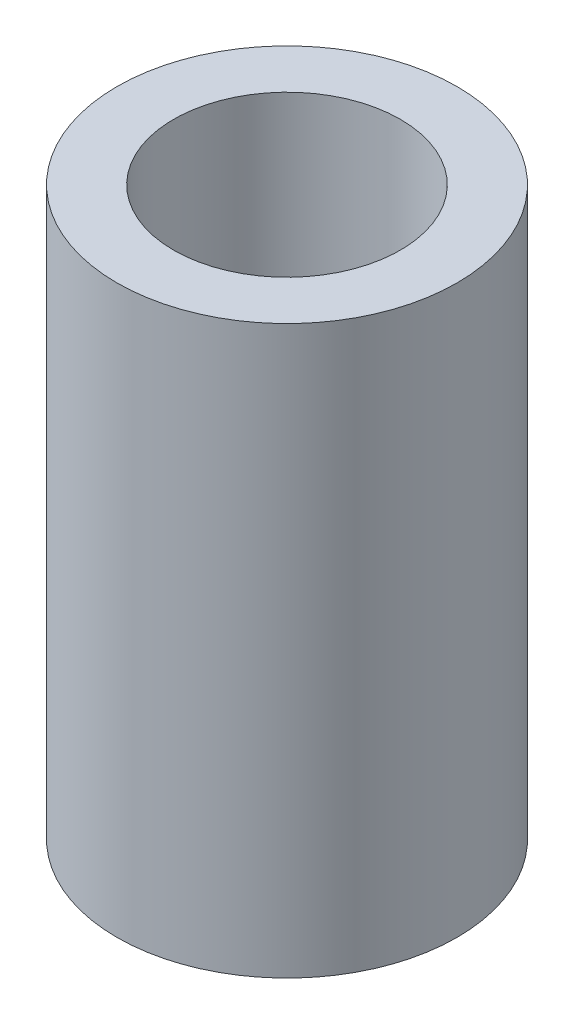
ISO-10303-21;
HEADER;
FILE_DESCRIPTION(('STEP AP214'),'2;1');
FILE_NAME('part.step','',(''),(''),'','','');
FILE_SCHEMA(('AUTOMOTIVE_DESIGN { 1 0 10303 214 1 1 1 1 }'));
ENDSEC;
DATA;
#1=APPLICATION_CONTEXT('core data for automotive mechanical design processes');
#2=APPLICATION_PROTOCOL_DEFINITION('international standard','automotive_design',2000,#1);
#3=PRODUCT_CONTEXT('',#1,'mechanical');
#4=PRODUCT('Part','Part','',(#3));
#5=PRODUCT_RELATED_PRODUCT_CATEGORY('part','',(#4));
#6=PRODUCT_DEFINITION_FORMATION('','',#4);
#7=PRODUCT_DEFINITION_CONTEXT('part definition',#1,'design');
#8=PRODUCT_DEFINITION('design','',#6,#7);
#9=PRODUCT_DEFINITION_SHAPE('','',#8);
#10=(LENGTH_UNIT() NAMED_UNIT(*) SI_UNIT(.MILLI.,.METRE.));
#11=(NAMED_UNIT(*) PLANE_ANGLE_UNIT() SI_UNIT($,.RADIAN.));
#12=(NAMED_UNIT(*) SI_UNIT($,.STERADIAN.) SOLID_ANGLE_UNIT());
#13=UNCERTAINTY_MEASURE_WITH_UNIT(LENGTH_MEASURE(1.E-05),#10,'distance_accuracy_value','');
#14=(GEOMETRIC_REPRESENTATION_CONTEXT(3) GLOBAL_UNCERTAINTY_ASSIGNED_CONTEXT((#13)) GLOBAL_UNIT_ASSIGNED_CONTEXT((#10,
#11,#12)) REPRESENTATION_CONTEXT('',''));
#15=CARTESIAN_POINT('',(0.,0.,0.));
#16=DIRECTION('',(0.,0.,1.));
#17=DIRECTION('',(1.,0.,0.));
#18=AXIS2_PLACEMENT_3D('',#15,#16,#17);
#19=CARTESIAN_POINT('',(0.,20.,0.));
#20=DIRECTION('',(0.,-1.,0.));
#21=DIRECTION('',(0.,0.,-1.));
#22=AXIS2_PLACEMENT_3D('',#19,#20,#21);
#23=CYLINDRICAL_SURFACE('',#22,6.);
#24=CARTESIAN_POINT('',(0.,20.,0.));
#25=DIRECTION('',(0.,1.,0.));
#26=DIRECTION('',(0.,0.,1.));
#27=AXIS2_PLACEMENT_3D('',#24,#25,#26);
#28=CIRCLE('',#27,6.);
#29=CARTESIAN_POINT('',(0.,20.,6.));
#30=VERTEX_POINT('',#29);
#31=EDGE_CURVE('E10',#30,#30,#28,.T.);
#32=ORIENTED_EDGE('',*,*,#31,.F.);
#33=EDGE_LOOP('',(#32));
#34=FACE_BOUND('',#33,.T.);
#35=CARTESIAN_POINT('',(0.,0.,0.));
#36=DIRECTION('',(0.,1.,0.));
#37=DIRECTION('',(0.,0.,1.));
#38=AXIS2_PLACEMENT_3D('',#35,#36,#37);
#39=CIRCLE('',#38,6.);
#40=CARTESIAN_POINT('',(0.,0.,6.));
#41=VERTEX_POINT('',#40);
#42=EDGE_CURVE('E40',#41,#41,#39,.T.);
#43=ORIENTED_EDGE('',*,*,#42,.T.);
#44=EDGE_LOOP('',(#43));
#45=FACE_BOUND('',#44,.T.);
#46=ADVANCED_FACE('F37',(#34,#45),#23,.T.);
#47=CARTESIAN_POINT('',(0.,20.,0.));
#48=DIRECTION('',(0.,1.,0.));
#49=DIRECTION('',(0.,0.,1.));
#50=AXIS2_PLACEMENT_3D('',#47,#48,#49);
#51=PLANE('',#50);
#52=CARTESIAN_POINT('',(0.,20.,0.));
#53=DIRECTION('',(0.,1.,0.));
#54=DIRECTION('',(0.,0.,1.));
#55=AXIS2_PLACEMENT_3D('',#52,#53,#54);
#56=CIRCLE('',#55,4.);
#57=CARTESIAN_POINT('',(0.,20.,4.));
#58=VERTEX_POINT('',#57);
#59=EDGE_CURVE('E51',#58,#58,#56,.T.);
#60=ORIENTED_EDGE('',*,*,#59,.F.);
#61=EDGE_LOOP('',(#60));
#62=FACE_BOUND('',#61,.T.);
#63=ORIENTED_EDGE('',*,*,#31,.T.);
#64=EDGE_LOOP('',(#63));
#65=FACE_BOUND('',#64,.T.);
#66=ADVANCED_FACE('F68',(#62,#65),#51,.T.);
#67=CARTESIAN_POINT('',(0.,0.,0.));
#68=DIRECTION('',(0.,1.,0.));
#69=DIRECTION('',(0.,0.,1.));
#70=AXIS2_PLACEMENT_3D('',#67,#68,#69);
#71=PLANE('',#70);
#72=CARTESIAN_POINT('',(0.,0.,0.));
#73=DIRECTION('',(0.,1.,0.));
#74=DIRECTION('',(0.,0.,1.));
#75=AXIS2_PLACEMENT_3D('',#72,#73,#74);
#76=CIRCLE('',#75,4.);
#77=CARTESIAN_POINT('',(0.,0.,4.));
#78=VERTEX_POINT('',#77);
#79=EDGE_CURVE('E49',#78,#78,#76,.T.);
#80=ORIENTED_EDGE('',*,*,#79,.T.);
#81=EDGE_LOOP('',(#80));
#82=FACE_BOUND('',#81,.T.);
#83=ORIENTED_EDGE('',*,*,#42,.F.);
#84=EDGE_LOOP('',(#83));
#85=FACE_BOUND('',#84,.T.);
#86=ADVANCED_FACE('F59',(#82,#85),#71,.F.);
#87=CARTESIAN_POINT('',(0.,0.,0.));
#88=DIRECTION('',(0.,1.,0.));
#89=DIRECTION('',(0.,0.,1.));
#90=AXIS2_PLACEMENT_3D('',#87,#88,#89);
#91=CYLINDRICAL_SURFACE('',#90,4.);
#92=ORIENTED_EDGE('',*,*,#79,.F.);
#93=EDGE_LOOP('',(#92));
#94=FACE_BOUND('',#93,.T.);
#95=ORIENTED_EDGE('',*,*,#59,.T.);
#96=EDGE_LOOP('',(#95));
#97=FACE_BOUND('',#96,.T.);
#98=ADVANCED_FACE('F62',(#94,#97),#91,.F.);
#99=CLOSED_SHELL('',(#46,#66,#86,#98));
#100=MANIFOLD_SOLID_BREP('B2',#99);
#101=ADVANCED_BREP_SHAPE_REPRESENTATION('',(#18,#100),#14);
#102=SHAPE_DEFINITION_REPRESENTATION(#9,#101);
ENDSEC;
END-ISO-10303-21;
